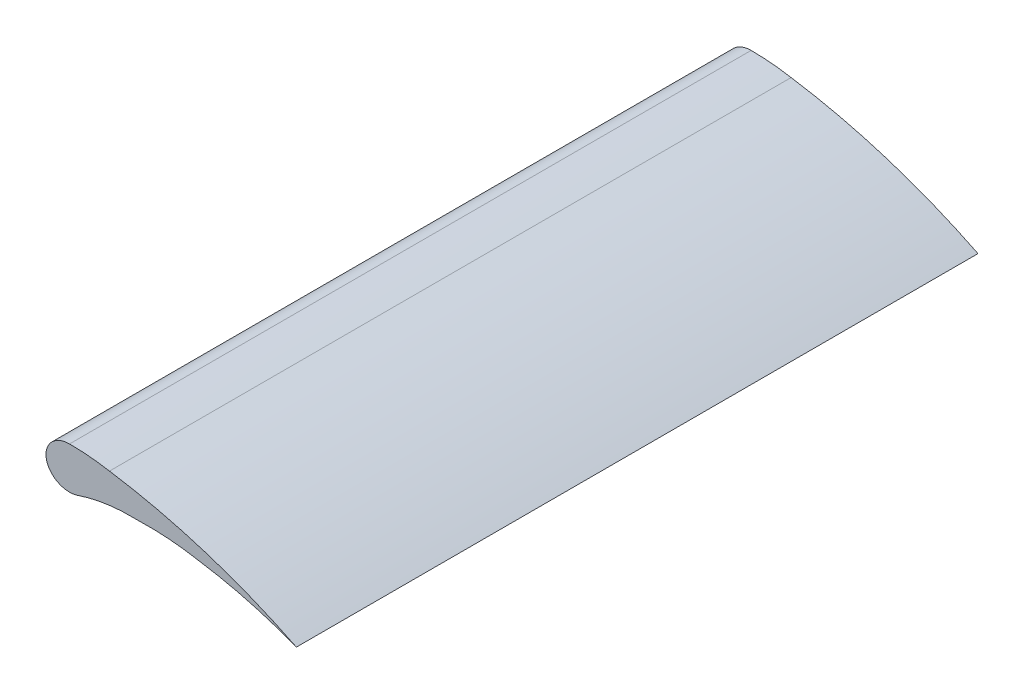
ISO-10303-21;
HEADER;
FILE_DESCRIPTION(('STEP AP214'),'2;1');
FILE_NAME('part.step','',(''),(''),'','','');
FILE_SCHEMA(('AUTOMOTIVE_DESIGN { 1 0 10303 214 1 1 1 1 }'));
ENDSEC;
DATA;
#1=APPLICATION_CONTEXT('core data for automotive mechanical design processes');
#2=APPLICATION_PROTOCOL_DEFINITION('international standard','automotive_design',2000,#1);
#3=PRODUCT_CONTEXT('',#1,'mechanical');
#4=PRODUCT('Part','Part','',(#3));
#5=PRODUCT_RELATED_PRODUCT_CATEGORY('part','',(#4));
#6=PRODUCT_DEFINITION_FORMATION('','',#4);
#7=PRODUCT_DEFINITION_CONTEXT('part definition',#1,'design');
#8=PRODUCT_DEFINITION('design','',#6,#7);
#9=PRODUCT_DEFINITION_SHAPE('','',#8);
#10=(LENGTH_UNIT() NAMED_UNIT(*) SI_UNIT(.MILLI.,.METRE.));
#11=(NAMED_UNIT(*) PLANE_ANGLE_UNIT() SI_UNIT($,.RADIAN.));
#12=(NAMED_UNIT(*) SI_UNIT($,.STERADIAN.) SOLID_ANGLE_UNIT());
#13=UNCERTAINTY_MEASURE_WITH_UNIT(LENGTH_MEASURE(1.E-05),#10,'distance_accuracy_value','');
#14=(GEOMETRIC_REPRESENTATION_CONTEXT(3) GLOBAL_UNCERTAINTY_ASSIGNED_CONTEXT((#13)) GLOBAL_UNIT_ASSIGNED_CONTEXT((#10,
#11,#12)) REPRESENTATION_CONTEXT('',''));
#15=CARTESIAN_POINT('',(0.,0.,0.));
#16=DIRECTION('',(0.,0.,1.));
#17=DIRECTION('',(1.,0.,0.));
#18=AXIS2_PLACEMENT_3D('',#15,#16,#17);
#19=CARTESIAN_POINT('',(16.0655843190915,-78.0987753126651,-127.));
#20=DIRECTION('',(0.,0.,1.));
#21=DIRECTION('',(1.,0.,0.));
#22=AXIS2_PLACEMENT_3D('',#19,#20,#21);
#23=CYLINDRICAL_SURFACE('',#22,83.8752882555201);
#24=CARTESIAN_POINT('',(16.0655843190915,-78.0987753126651,0.));
#25=DIRECTION('',(0.,0.,-1.));
#26=DIRECTION('',(-1.,0.,0.));
#27=AXIS2_PLACEMENT_3D('',#24,#25,#26);
#28=CIRCLE('',#27,83.8752882555201);
#29=CARTESIAN_POINT('',(28.50866529278,4.84839893594225,0.));
#30=VERTEX_POINT('',#29);
#31=CARTESIAN_POINT('',(46.6539035702117,0.,0.));
#32=VERTEX_POINT('',#31);
#33=EDGE_CURVE('E123',#30,#32,#28,.T.);
#34=ORIENTED_EDGE('',*,*,#33,.F.);
#35=DIRECTION('',(0.,0.,1.));
#36=VECTOR('',#35,1.);
#37=CARTESIAN_POINT('',(28.50866529278,4.84839893594225,-127.));
#38=LINE('',#37,#36);
#39=CARTESIAN_POINT('',(28.50866529278,4.84839893594225,-127.));
#40=VERTEX_POINT('',#39);
#41=EDGE_CURVE('E11',#40,#30,#38,.T.);
#42=ORIENTED_EDGE('',*,*,#41,.F.);
#43=CARTESIAN_POINT('',(16.0655843190915,-78.0987753126651,-127.));
#44=DIRECTION('',(0.,0.,-1.));
#45=DIRECTION('',(-1.,0.,0.));
#46=AXIS2_PLACEMENT_3D('',#43,#44,#45);
#47=CIRCLE('',#46,83.8752882555201);
#48=CARTESIAN_POINT('',(46.6539035702117,0.,-127.));
#49=VERTEX_POINT('',#48);
#50=EDGE_CURVE('E140',#40,#49,#47,.T.);
#51=ORIENTED_EDGE('',*,*,#50,.T.);
#52=DIRECTION('',(0.,0.,1.));
#53=VECTOR('',#52,1.);
#54=CARTESIAN_POINT('',(46.6539035702117,0.,-127.));
#55=LINE('',#54,#53);
#56=EDGE_CURVE('E34',#49,#32,#55,.T.);
#57=ORIENTED_EDGE('',*,*,#56,.T.);
#58=EDGE_LOOP('',(#34,#42,#51,#57));
#59=FACE_BOUND('',#58,.T.);
#60=ADVANCED_FACE('F31',(#59),#23,.F.);
#61=CARTESIAN_POINT('',(18.9974176144024,-46.045534130015,-127.));
#62=DIRECTION('',(0.,0.,1.));
#63=DIRECTION('',(1.,0.,0.));
#64=AXIS2_PLACEMENT_3D('',#61,#62,#63);
#65=CYLINDRICAL_SURFACE('',#64,51.7750543729467);
#66=CARTESIAN_POINT('',(18.9974176144024,-46.045534130015,0.));
#67=DIRECTION('',(0.,0.,-1.));
#68=DIRECTION('',(-1.,0.,0.));
#69=AXIS2_PLACEMENT_3D('',#66,#67,#68);
#70=CIRCLE('',#69,51.7750543729467);
#71=CARTESIAN_POINT('',(17.4360899812911,5.70597320401021,0.));
#72=VERTEX_POINT('',#71);
#73=EDGE_CURVE('E138',#72,#30,#70,.T.);
#74=ORIENTED_EDGE('',*,*,#73,.F.);
#75=DIRECTION('',(0.,0.,1.));
#76=VECTOR('',#75,1.);
#77=CARTESIAN_POINT('',(17.4360899812911,5.70597320401021,-127.));
#78=LINE('',#77,#76);
#79=CARTESIAN_POINT('',(17.4360899812911,5.70597320401021,-127.));
#80=VERTEX_POINT('',#79);
#81=EDGE_CURVE('E40',#80,#72,#78,.T.);
#82=ORIENTED_EDGE('',*,*,#81,.F.);
#83=CARTESIAN_POINT('',(18.9974176144024,-46.045534130015,-127.));
#84=DIRECTION('',(0.,0.,-1.));
#85=DIRECTION('',(-1.,0.,0.));
#86=AXIS2_PLACEMENT_3D('',#83,#84,#85);
#87=CIRCLE('',#86,51.7750543729467);
#88=EDGE_CURVE('E112',#80,#40,#87,.T.);
#89=ORIENTED_EDGE('',*,*,#88,.T.);
#90=ORIENTED_EDGE('',*,*,#41,.T.);
#91=EDGE_LOOP('',(#74,#82,#89,#90));
#92=FACE_BOUND('',#91,.T.);
#93=ADVANCED_FACE('F150',(#92),#65,.F.);
#94=CARTESIAN_POINT('',(16.6701280260344,31.0944214095052,-127.));
#95=DIRECTION('',(0.,0.,1.));
#96=DIRECTION('',(1.,0.,0.));
#97=AXIS2_PLACEMENT_3D('',#94,#95,#96);
#98=CYLINDRICAL_SURFACE('',#97,25.4);
#99=CARTESIAN_POINT('',(16.6701280260344,31.0944214095052,0.));
#100=DIRECTION('',(0.,0.,1.));
#101=DIRECTION('',(1.,0.,0.));
#102=AXIS2_PLACEMENT_3D('',#99,#100,#101);
#103=CIRCLE('',#102,25.4);
#104=CARTESIAN_POINT('',(16.1937606472403,5.69888884725278,0.));
#105=VERTEX_POINT('',#104);
#106=EDGE_CURVE('E99',#105,#72,#103,.T.);
#107=ORIENTED_EDGE('',*,*,#106,.F.);
#108=DIRECTION('',(0.,0.,1.));
#109=VECTOR('',#108,1.);
#110=CARTESIAN_POINT('',(16.1937606472403,5.69888884725278,-127.));
#111=LINE('',#110,#109);
#112=CARTESIAN_POINT('',(16.1937606472403,5.69888884725278,-127.));
#113=VERTEX_POINT('',#112);
#114=EDGE_CURVE('E94',#113,#105,#111,.T.);
#115=ORIENTED_EDGE('',*,*,#114,.F.);
#116=CARTESIAN_POINT('',(16.6701280260344,31.0944214095052,-127.));
#117=DIRECTION('',(0.,0.,1.));
#118=DIRECTION('',(1.,0.,0.));
#119=AXIS2_PLACEMENT_3D('',#116,#117,#118);
#120=CIRCLE('',#119,25.4);
#121=EDGE_CURVE('E97',#113,#80,#120,.T.);
#122=ORIENTED_EDGE('',*,*,#121,.T.);
#123=ORIENTED_EDGE('',*,*,#81,.T.);
#124=EDGE_LOOP('',(#107,#115,#122,#123));
#125=FACE_BOUND('',#124,.T.);
#126=ADVANCED_FACE('F96',(#125),#98,.T.);
#127=CARTESIAN_POINT('',(15.6217955174053,-24.7930376065845,-127.));
#128=DIRECTION('',(0.,0.,1.));
#129=DIRECTION('',(1.,0.,0.));
#130=AXIS2_PLACEMENT_3D('',#127,#128,#129);
#131=CYLINDRICAL_SURFACE('',#130,30.4972904202319);
#132=CARTESIAN_POINT('',(15.6217955174053,-24.7930376065845,0.));
#133=DIRECTION('',(0.,0.,-1.));
#134=DIRECTION('',(-1.,0.,0.));
#135=AXIS2_PLACEMENT_3D('',#132,#133,#134);
#136=CIRCLE('',#135,30.4972904202319);
#137=CARTESIAN_POINT('',(5.98824330569878,4.14274292134136,0.));
#138=VERTEX_POINT('',#137);
#139=EDGE_CURVE('E135',#138,#105,#136,.T.);
#140=ORIENTED_EDGE('',*,*,#139,.F.);
#141=DIRECTION('',(0.,0.,1.));
#142=VECTOR('',#141,1.);
#143=CARTESIAN_POINT('',(5.98824330569878,4.14274292134136,-127.));
#144=LINE('',#143,#142);
#145=CARTESIAN_POINT('',(5.98824330569878,4.14274292134136,-127.));
#146=VERTEX_POINT('',#145);
#147=EDGE_CURVE('E104',#146,#138,#144,.T.);
#148=ORIENTED_EDGE('',*,*,#147,.F.);
#149=CARTESIAN_POINT('',(15.6217955174053,-24.7930376065845,-127.));
#150=DIRECTION('',(0.,0.,-1.));
#151=DIRECTION('',(-1.,0.,0.));
#152=AXIS2_PLACEMENT_3D('',#149,#150,#151);
#153=CIRCLE('',#152,30.4972904202319);
#154=EDGE_CURVE('E110',#146,#113,#153,.T.);
#155=ORIENTED_EDGE('',*,*,#154,.T.);
#156=ORIENTED_EDGE('',*,*,#114,.T.);
#157=EDGE_LOOP('',(#140,#148,#155,#156));
#158=FACE_BOUND('',#157,.T.);
#159=ADVANCED_FACE('F114',(#158),#131,.F.);
#160=CARTESIAN_POINT('',(4.38129295561905,7.76179505707707,-127.));
#161=DIRECTION('',(0.,0.,1.));
#162=DIRECTION('',(-1.,0.,0.));
#163=AXIS2_PLACEMENT_3D('',#160,#161,#162);
#164=ELLIPSE('',#163,4.38129295561905,3.89015914335055);
#165=DIRECTION('',(0.,0.,1.));
#166=VECTOR('',#165,1.);
#167=SURFACE_OF_LINEAR_EXTRUSION('',#164,#166);
#168=CARTESIAN_POINT('',(4.38129295561905,7.76179505707707,0.));
#169=DIRECTION('',(0.,0.,1.));
#170=DIRECTION('',(-1.,0.,0.));
#171=AXIS2_PLACEMENT_3D('',#168,#169,#170);
#172=ELLIPSE('',#171,4.38129295561905,3.89015914335055);
#173=CARTESIAN_POINT('',(4.38129295561905,11.6519542004276,0.));
#174=VERTEX_POINT('',#173);
#175=EDGE_CURVE('E132',#174,#138,#172,.T.);
#176=ORIENTED_EDGE('',*,*,#175,.F.);
#177=DIRECTION('',(0.,0.,1.));
#178=VECTOR('',#177,1.);
#179=CARTESIAN_POINT('',(4.38129295561905,11.6519542004276,-127.));
#180=LINE('',#179,#178);
#181=CARTESIAN_POINT('',(4.38129295561905,11.6519542004276,-127.));
#182=VERTEX_POINT('',#181);
#183=EDGE_CURVE('E144',#182,#174,#180,.T.);
#184=ORIENTED_EDGE('',*,*,#183,.F.);
#185=EDGE_CURVE('E115',#182,#146,#164,.T.);
#186=ORIENTED_EDGE('',*,*,#185,.T.);
#187=ORIENTED_EDGE('',*,*,#147,.T.);
#188=EDGE_LOOP('',(#176,#184,#186,#187));
#189=FACE_BOUND('',#188,.T.);
#190=ADVANCED_FACE('F163',(#189),#167,.T.);
#191=CARTESIAN_POINT('',(4.38129295561905,-31.0825879537744,-127.));
#192=DIRECTION('',(0.,0.,1.));
#193=DIRECTION('',(1.,0.,0.));
#194=AXIS2_PLACEMENT_3D('',#191,#192,#193);
#195=CYLINDRICAL_SURFACE('',#194,42.734542154202);
#196=CARTESIAN_POINT('',(4.38129295561905,-31.0825879537744,0.));
#197=DIRECTION('',(0.,0.,1.));
#198=DIRECTION('',(1.,0.,0.));
#199=AXIS2_PLACEMENT_3D('',#196,#197,#198);
#200=CIRCLE('',#199,42.734542154202);
#201=CARTESIAN_POINT('',(11.8312688513373,10.9975611938045,0.));
#202=VERTEX_POINT('',#201);
#203=EDGE_CURVE('E129',#202,#174,#200,.T.);
#204=ORIENTED_EDGE('',*,*,#203,.F.);
#205=DIRECTION('',(0.,0.,1.));
#206=VECTOR('',#205,1.);
#207=CARTESIAN_POINT('',(11.8312688513373,10.9975611938045,-127.));
#208=LINE('',#207,#206);
#209=CARTESIAN_POINT('',(11.8312688513373,10.9975611938045,-127.));
#210=VERTEX_POINT('',#209);
#211=EDGE_CURVE('E145',#210,#202,#208,.T.);
#212=ORIENTED_EDGE('',*,*,#211,.F.);
#213=CARTESIAN_POINT('',(4.38129295561905,-31.0825879537744,-127.));
#214=DIRECTION('',(0.,0.,1.));
#215=DIRECTION('',(1.,0.,0.));
#216=AXIS2_PLACEMENT_3D('',#213,#214,#215);
#217=CIRCLE('',#216,42.734542154202);
#218=EDGE_CURVE('E117',#210,#182,#217,.T.);
#219=ORIENTED_EDGE('',*,*,#218,.T.);
#220=ORIENTED_EDGE('',*,*,#183,.T.);
#221=EDGE_LOOP('',(#204,#212,#219,#220));
#222=FACE_BOUND('',#221,.T.);
#223=ADVANCED_FACE('F166',(#222),#195,.T.);
#224=CARTESIAN_POINT('',(-6.40743177315885,-107.383296810876,-127.));
#225=DIRECTION('',(0.,0.,1.));
#226=DIRECTION('',(1.,0.,0.));
#227=AXIS2_PLACEMENT_3D('',#224,#225,#226);
#228=CYLINDRICAL_SURFACE('',#227,119.777617869092);
#229=CARTESIAN_POINT('',(-6.40743177315885,-107.383296810876,0.));
#230=DIRECTION('',(0.,0.,1.));
#231=DIRECTION('',(-1.,0.,0.));
#232=AXIS2_PLACEMENT_3D('',#229,#230,#231);
#233=CIRCLE('',#232,119.777617869092);
#234=EDGE_CURVE('E126',#32,#202,#233,.T.);
#235=ORIENTED_EDGE('',*,*,#234,.F.);
#236=ORIENTED_EDGE('',*,*,#56,.F.);
#237=CARTESIAN_POINT('',(-6.40743177315885,-107.383296810876,-127.));
#238=DIRECTION('',(0.,0.,1.));
#239=DIRECTION('',(-1.,0.,0.));
#240=AXIS2_PLACEMENT_3D('',#237,#238,#239);
#241=CIRCLE('',#240,119.777617869092);
#242=EDGE_CURVE('E228',#49,#210,#241,.T.);
#243=ORIENTED_EDGE('',*,*,#242,.T.);
#244=ORIENTED_EDGE('',*,*,#211,.T.);
#245=EDGE_LOOP('',(#235,#236,#243,#244));
#246=FACE_BOUND('',#245,.T.);
#247=ADVANCED_FACE('F147',(#246),#228,.T.);
#248=CARTESIAN_POINT('',(4.38129295561905,7.76179505707707,-127.));
#249=DIRECTION('',(0.,0.,1.));
#250=DIRECTION('',(1.,0.,0.));
#251=AXIS2_PLACEMENT_3D('',#248,#249,#250);
#252=PLANE('',#251);
#253=ORIENTED_EDGE('',*,*,#50,.F.);
#254=ORIENTED_EDGE('',*,*,#88,.F.);
#255=ORIENTED_EDGE('',*,*,#121,.F.);
#256=ORIENTED_EDGE('',*,*,#154,.F.);
#257=ORIENTED_EDGE('',*,*,#185,.F.);
#258=ORIENTED_EDGE('',*,*,#218,.F.);
#259=ORIENTED_EDGE('',*,*,#242,.F.);
#260=EDGE_LOOP('',(#253,#254,#255,#256,#257,#258,#259));
#261=FACE_BOUND('',#260,.T.);
#262=ADVANCED_FACE('F108',(#261),#252,.F.);
#263=CARTESIAN_POINT('',(4.38129295561905,7.76179505707707,0.));
#264=DIRECTION('',(0.,0.,1.));
#265=DIRECTION('',(1.,0.,0.));
#266=AXIS2_PLACEMENT_3D('',#263,#264,#265);
#267=PLANE('',#266);
#268=ORIENTED_EDGE('',*,*,#33,.T.);
#269=ORIENTED_EDGE('',*,*,#234,.T.);
#270=ORIENTED_EDGE('',*,*,#203,.T.);
#271=ORIENTED_EDGE('',*,*,#175,.T.);
#272=ORIENTED_EDGE('',*,*,#139,.T.);
#273=ORIENTED_EDGE('',*,*,#106,.T.);
#274=ORIENTED_EDGE('',*,*,#73,.T.);
#275=EDGE_LOOP('',(#268,#269,#270,#271,#272,#273,#274));
#276=FACE_BOUND('',#275,.T.);
#277=ADVANCED_FACE('F149',(#276),#267,.T.);
#278=CLOSED_SHELL('',(#60,#93,#126,#159,#190,#223,#247,#262,#277));
#279=MANIFOLD_SOLID_BREP('B2',#278);
#280=ADVANCED_BREP_SHAPE_REPRESENTATION('',(#18,#279),#14);
#281=SHAPE_DEFINITION_REPRESENTATION(#9,#280);
ENDSEC;
END-ISO-10303-21;
